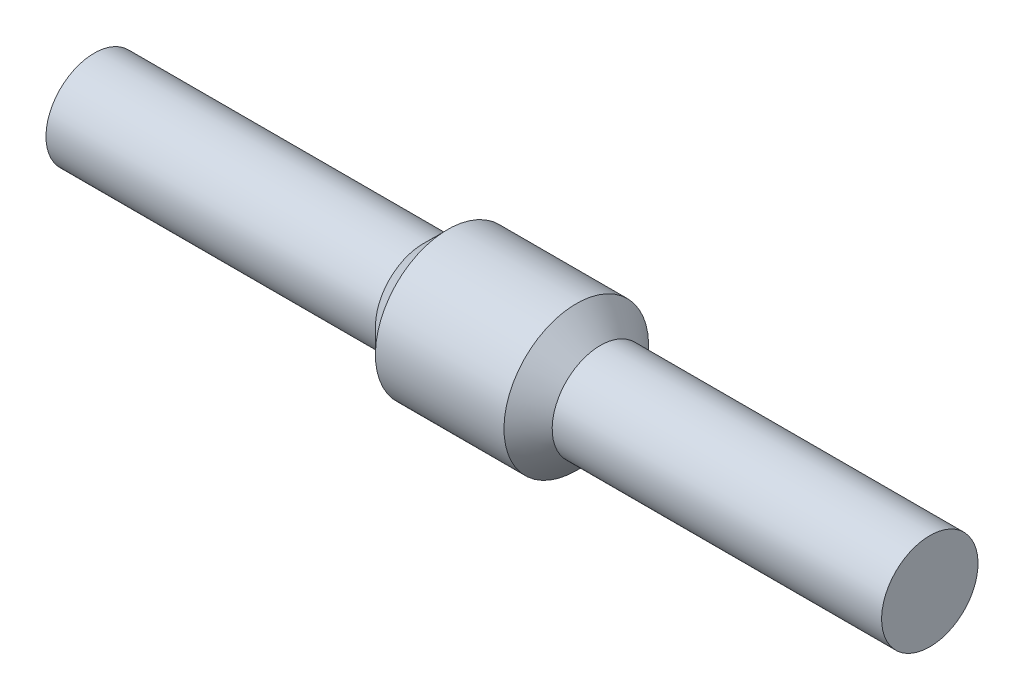
ISO-10303-21;
HEADER;
FILE_DESCRIPTION(('STEP AP214'),'2;1');
FILE_NAME('part.step','',(''),(''),'','','');
FILE_SCHEMA(('AUTOMOTIVE_DESIGN { 1 0 10303 214 1 1 1 1 }'));
ENDSEC;
DATA;
#1=APPLICATION_CONTEXT('core data for automotive mechanical design processes');
#2=APPLICATION_PROTOCOL_DEFINITION('international standard','automotive_design',2000,#1);
#3=PRODUCT_CONTEXT('',#1,'mechanical');
#4=PRODUCT('Part','Part','',(#3));
#5=PRODUCT_RELATED_PRODUCT_CATEGORY('part','',(#4));
#6=PRODUCT_DEFINITION_FORMATION('','',#4);
#7=PRODUCT_DEFINITION_CONTEXT('part definition',#1,'design');
#8=PRODUCT_DEFINITION('design','',#6,#7);
#9=PRODUCT_DEFINITION_SHAPE('','',#8);
#10=(LENGTH_UNIT() NAMED_UNIT(*) SI_UNIT(.MILLI.,.METRE.));
#11=(NAMED_UNIT(*) PLANE_ANGLE_UNIT() SI_UNIT($,.RADIAN.));
#12=(NAMED_UNIT(*) SI_UNIT($,.STERADIAN.) SOLID_ANGLE_UNIT());
#13=UNCERTAINTY_MEASURE_WITH_UNIT(LENGTH_MEASURE(1.E-05),#10,'distance_accuracy_value','');
#14=(GEOMETRIC_REPRESENTATION_CONTEXT(3) GLOBAL_UNCERTAINTY_ASSIGNED_CONTEXT((#13)) GLOBAL_UNIT_ASSIGNED_CONTEXT((#10,
#11,#12)) REPRESENTATION_CONTEXT('',''));
#15=CARTESIAN_POINT('',(0.,0.,0.));
#16=DIRECTION('',(0.,0.,1.));
#17=DIRECTION('',(1.,0.,0.));
#18=AXIS2_PLACEMENT_3D('',#15,#16,#17);
#19=CARTESIAN_POINT('',(-13.,0.,0.));
#20=DIRECTION('',(1.,0.,0.));
#21=DIRECTION('',(0.,1.,0.));
#22=AXIS2_PLACEMENT_3D('',#19,#20,#21);
#23=PLANE('',#22);
#24=CARTESIAN_POINT('',(-13.,0.,0.));
#25=DIRECTION('',(-1.,0.,0.));
#26=DIRECTION('',(0.,-1.,0.));
#27=AXIS2_PLACEMENT_3D('',#24,#25,#26);
#28=CIRCLE('',#27,1.5);
#29=CARTESIAN_POINT('',(-13.,-1.5,0.));
#30=VERTEX_POINT('',#29);
#31=EDGE_CURVE('E10',#30,#30,#28,.T.);
#32=ORIENTED_EDGE('',*,*,#31,.T.);
#33=EDGE_LOOP('',(#32));
#34=FACE_BOUND('',#33,.T.);
#35=ADVANCED_FACE('F35',(#34),#23,.F.);
#36=CARTESIAN_POINT('',(-13.,0.,0.));
#37=DIRECTION('',(-1.,0.,0.));
#38=DIRECTION('',(0.,-1.,0.));
#39=AXIS2_PLACEMENT_3D('',#36,#37,#38);
#40=CYLINDRICAL_SURFACE('',#39,1.5);
#41=ORIENTED_EDGE('',*,*,#31,.F.);
#42=EDGE_LOOP('',(#41));
#43=FACE_BOUND('',#42,.T.);
#44=CARTESIAN_POINT('',(-2.75,0.,0.));
#45=DIRECTION('',(-1.,0.,0.));
#46=DIRECTION('',(0.,-1.,0.));
#47=AXIS2_PLACEMENT_3D('',#44,#45,#46);
#48=CIRCLE('',#47,1.5);
#49=CARTESIAN_POINT('',(-2.75,-1.5,0.));
#50=VERTEX_POINT('',#49);
#51=EDGE_CURVE('E41',#50,#50,#48,.T.);
#52=ORIENTED_EDGE('',*,*,#51,.T.);
#53=EDGE_LOOP('',(#52));
#54=FACE_BOUND('',#53,.T.);
#55=ADVANCED_FACE('F73',(#43,#54),#40,.T.);
#56=CARTESIAN_POINT('',(-2.,0.,0.));
#57=DIRECTION('',(1.,0.,0.));
#58=DIRECTION('',(0.,1.,0.));
#59=AXIS2_PLACEMENT_3D('',#56,#57,#58);
#60=CONICAL_SURFACE('',#59,2.25,0.785398163397449);
#61=ORIENTED_EDGE('',*,*,#51,.F.);
#62=EDGE_LOOP('',(#61));
#63=FACE_BOUND('',#62,.T.);
#64=CARTESIAN_POINT('',(-2.,0.,0.));
#65=DIRECTION('',(-1.,0.,0.));
#66=DIRECTION('',(0.,-1.,0.));
#67=AXIS2_PLACEMENT_3D('',#64,#65,#66);
#68=CIRCLE('',#67,2.25);
#69=CARTESIAN_POINT('',(-2.,-2.25,0.));
#70=VERTEX_POINT('',#69);
#71=EDGE_CURVE('E45',#70,#70,#68,.T.);
#72=ORIENTED_EDGE('',*,*,#71,.T.);
#73=EDGE_LOOP('',(#72));
#74=FACE_BOUND('',#73,.T.);
#75=ADVANCED_FACE('F77',(#63,#74),#60,.T.);
#76=CARTESIAN_POINT('',(-13.,0.,0.));
#77=DIRECTION('',(-1.,0.,0.));
#78=DIRECTION('',(0.,-1.,0.));
#79=AXIS2_PLACEMENT_3D('',#76,#77,#78);
#80=CYLINDRICAL_SURFACE('',#79,2.25);
#81=ORIENTED_EDGE('',*,*,#71,.F.);
#82=EDGE_LOOP('',(#81));
#83=FACE_BOUND('',#82,.T.);
#84=CARTESIAN_POINT('',(2.,0.,0.));
#85=DIRECTION('',(-1.,0.,0.));
#86=DIRECTION('',(0.,-1.,0.));
#87=AXIS2_PLACEMENT_3D('',#84,#85,#86);
#88=CIRCLE('',#87,2.25);
#89=CARTESIAN_POINT('',(2.,-2.25,0.));
#90=VERTEX_POINT('',#89);
#91=EDGE_CURVE('E49',#90,#90,#88,.T.);
#92=ORIENTED_EDGE('',*,*,#91,.T.);
#93=EDGE_LOOP('',(#92));
#94=FACE_BOUND('',#93,.T.);
#95=ADVANCED_FACE('F82',(#83,#94),#80,.T.);
#96=CARTESIAN_POINT('',(2.75,0.,0.));
#97=DIRECTION('',(-1.,0.,0.));
#98=DIRECTION('',(0.,-1.,0.));
#99=AXIS2_PLACEMENT_3D('',#96,#97,#98);
#100=CONICAL_SURFACE('',#99,1.5,0.785398163397449);
#101=ORIENTED_EDGE('',*,*,#91,.F.);
#102=EDGE_LOOP('',(#101));
#103=FACE_BOUND('',#102,.T.);
#104=CARTESIAN_POINT('',(2.75,0.,0.));
#105=DIRECTION('',(-1.,0.,0.));
#106=DIRECTION('',(0.,-1.,0.));
#107=AXIS2_PLACEMENT_3D('',#104,#105,#106);
#108=CIRCLE('',#107,1.5);
#109=CARTESIAN_POINT('',(2.75,-1.5,0.));
#110=VERTEX_POINT('',#109);
#111=EDGE_CURVE('E54',#110,#110,#108,.T.);
#112=ORIENTED_EDGE('',*,*,#111,.T.);
#113=EDGE_LOOP('',(#112));
#114=FACE_BOUND('',#113,.T.);
#115=ADVANCED_FACE('F69',(#103,#114),#100,.T.);
#116=CARTESIAN_POINT('',(-13.,0.,0.));
#117=DIRECTION('',(-1.,0.,0.));
#118=DIRECTION('',(0.,-1.,0.));
#119=AXIS2_PLACEMENT_3D('',#116,#117,#118);
#120=CYLINDRICAL_SURFACE('',#119,1.5);
#121=ORIENTED_EDGE('',*,*,#111,.F.);
#122=EDGE_LOOP('',(#121));
#123=FACE_BOUND('',#122,.T.);
#124=CARTESIAN_POINT('',(13.,0.,0.));
#125=DIRECTION('',(-1.,0.,0.));
#126=DIRECTION('',(0.,-1.,0.));
#127=AXIS2_PLACEMENT_3D('',#124,#125,#126);
#128=CIRCLE('',#127,1.5);
#129=CARTESIAN_POINT('',(13.,-1.5,0.));
#130=VERTEX_POINT('',#129);
#131=EDGE_CURVE('E57',#130,#130,#128,.T.);
#132=ORIENTED_EDGE('',*,*,#131,.T.);
#133=EDGE_LOOP('',(#132));
#134=FACE_BOUND('',#133,.T.);
#135=ADVANCED_FACE('F61',(#123,#134),#120,.T.);
#136=CARTESIAN_POINT('',(13.,1.5,0.));
#137=DIRECTION('',(-1.,0.,0.));
#138=DIRECTION('',(0.,-1.,0.));
#139=AXIS2_PLACEMENT_3D('',#136,#137,#138);
#140=PLANE('',#139);
#141=ORIENTED_EDGE('',*,*,#131,.F.);
#142=EDGE_LOOP('',(#141));
#143=FACE_BOUND('',#142,.T.);
#144=ADVANCED_FACE('F63',(#143),#140,.F.);
#145=CLOSED_SHELL('',(#35,#55,#75,#95,#115,#135,#144));
#146=MANIFOLD_SOLID_BREP('B2',#145);
#147=ADVANCED_BREP_SHAPE_REPRESENTATION('',(#18,#146),#14);
#148=SHAPE_DEFINITION_REPRESENTATION(#9,#147);
ENDSEC;
END-ISO-10303-21;
